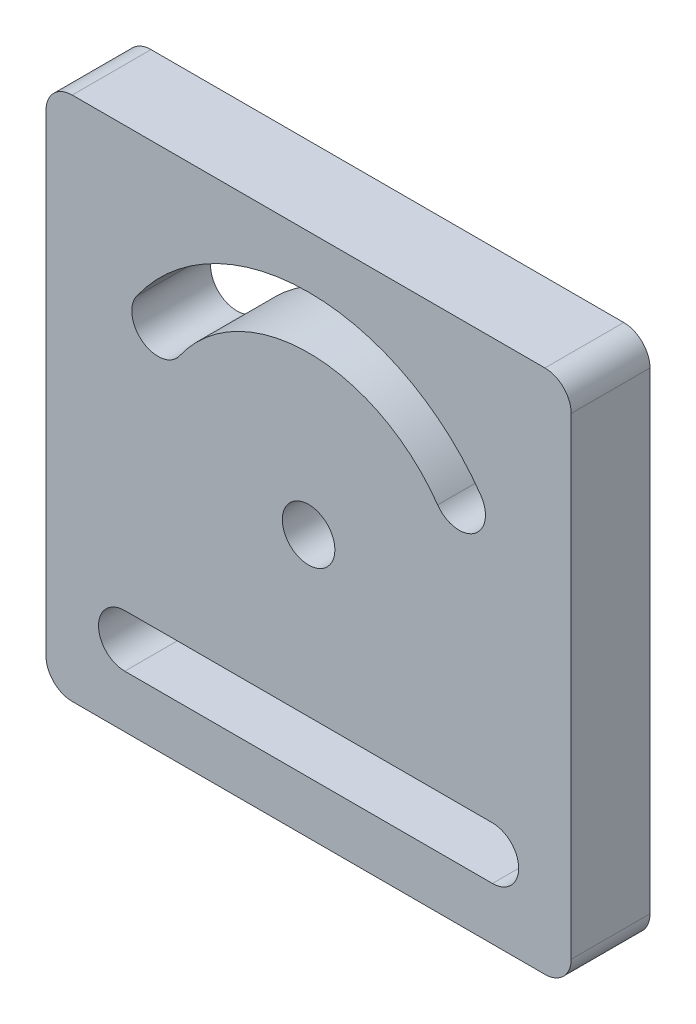
ISO-10303-21;
HEADER;
FILE_DESCRIPTION(('STEP AP214'),'2;1');
FILE_NAME('part.step','',(''),(''),'','','');
FILE_SCHEMA(('AUTOMOTIVE_DESIGN { 1 0 10303 214 1 1 1 1 }'));
ENDSEC;
DATA;
#1=APPLICATION_CONTEXT('core data for automotive mechanical design processes');
#2=APPLICATION_PROTOCOL_DEFINITION('international standard','automotive_design',2000,#1);
#3=PRODUCT_CONTEXT('',#1,'mechanical');
#4=PRODUCT('Part','Part','',(#3));
#5=PRODUCT_RELATED_PRODUCT_CATEGORY('part','',(#4));
#6=PRODUCT_DEFINITION_FORMATION('','',#4);
#7=PRODUCT_DEFINITION_CONTEXT('part definition',#1,'design');
#8=PRODUCT_DEFINITION('design','',#6,#7);
#9=PRODUCT_DEFINITION_SHAPE('','',#8);
#10=(LENGTH_UNIT() NAMED_UNIT(*) SI_UNIT(.MILLI.,.METRE.));
#11=(NAMED_UNIT(*) PLANE_ANGLE_UNIT() SI_UNIT($,.RADIAN.));
#12=(NAMED_UNIT(*) SI_UNIT($,.STERADIAN.) SOLID_ANGLE_UNIT());
#13=UNCERTAINTY_MEASURE_WITH_UNIT(LENGTH_MEASURE(1.E-05),#10,'distance_accuracy_value','');
#14=(GEOMETRIC_REPRESENTATION_CONTEXT(3) GLOBAL_UNCERTAINTY_ASSIGNED_CONTEXT((#13)) GLOBAL_UNIT_ASSIGNED_CONTEXT((#10,
#11,#12)) REPRESENTATION_CONTEXT('',''));
#15=CARTESIAN_POINT('',(0.,0.,0.));
#16=DIRECTION('',(0.,0.,1.));
#17=DIRECTION('',(1.,0.,0.));
#18=AXIS2_PLACEMENT_3D('',#15,#16,#17);
#19=CARTESIAN_POINT('',(0.,0.,30.));
#20=DIRECTION('',(0.,0.,1.));
#21=DIRECTION('',(1.,0.,0.));
#22=AXIS2_PLACEMENT_3D('',#19,#20,#21);
#23=PLANE('',#22);
#24=DIRECTION('',(0.,-1.,0.));
#25=VECTOR('',#24,1.);
#26=CARTESIAN_POINT('',(-100.,-100.,30.));
#27=LINE('',#26,#25);
#28=CARTESIAN_POINT('',(-100.,90.,30.));
#29=VERTEX_POINT('',#28);
#30=CARTESIAN_POINT('',(-100.,-90.0000000000001,30.));
#31=VERTEX_POINT('',#30);
#32=EDGE_CURVE('E226',#29,#31,#27,.T.);
#33=ORIENTED_EDGE('',*,*,#32,.T.);
#34=CARTESIAN_POINT('',(-90.,-90.0000000000001,30.));
#35=DIRECTION('',(0.,0.,1.));
#36=DIRECTION('',(1.,0.,0.));
#37=AXIS2_PLACEMENT_3D('',#34,#35,#36);
#38=CIRCLE('',#37,10.);
#39=CARTESIAN_POINT('',(-90.,-100.,30.));
#40=VERTEX_POINT('',#39);
#41=EDGE_CURVE('E269',#31,#40,#38,.T.);
#42=ORIENTED_EDGE('',*,*,#41,.T.);
#43=DIRECTION('',(1.,0.,0.));
#44=VECTOR('',#43,1.);
#45=CARTESIAN_POINT('',(100.,-100.,30.));
#46=LINE('',#45,#44);
#47=CARTESIAN_POINT('',(90.,-100.,30.));
#48=VERTEX_POINT('',#47);
#49=EDGE_CURVE('E229',#40,#48,#46,.T.);
#50=ORIENTED_EDGE('',*,*,#49,.T.);
#51=CARTESIAN_POINT('',(90.,-90.0000000000001,30.));
#52=DIRECTION('',(0.,0.,1.));
#53=DIRECTION('',(1.,0.,0.));
#54=AXIS2_PLACEMENT_3D('',#51,#52,#53);
#55=CIRCLE('',#54,10.);
#56=CARTESIAN_POINT('',(100.,-90.0000000000001,30.));
#57=VERTEX_POINT('',#56);
#58=EDGE_CURVE('E267',#48,#57,#55,.T.);
#59=ORIENTED_EDGE('',*,*,#58,.T.);
#60=DIRECTION('',(0.,1.,0.));
#61=VECTOR('',#60,1.);
#62=CARTESIAN_POINT('',(100.,-100.,30.));
#63=LINE('',#62,#61);
#64=CARTESIAN_POINT('',(100.,90.,30.));
#65=VERTEX_POINT('',#64);
#66=EDGE_CURVE('E233',#57,#65,#63,.T.);
#67=ORIENTED_EDGE('',*,*,#66,.T.);
#68=CARTESIAN_POINT('',(90.,90.,30.));
#69=DIRECTION('',(0.,0.,1.));
#70=DIRECTION('',(1.,0.,0.));
#71=AXIS2_PLACEMENT_3D('',#68,#69,#70);
#72=CIRCLE('',#71,10.);
#73=CARTESIAN_POINT('',(90.,100.,30.));
#74=VERTEX_POINT('',#73);
#75=EDGE_CURVE('E54',#65,#74,#72,.T.);
#76=ORIENTED_EDGE('',*,*,#75,.T.);
#77=DIRECTION('',(-1.,0.,0.));
#78=VECTOR('',#77,1.);
#79=CARTESIAN_POINT('',(100.,100.,30.));
#80=LINE('',#79,#78);
#81=CARTESIAN_POINT('',(-90.,99.9999999999999,30.));
#82=VERTEX_POINT('',#81);
#83=EDGE_CURVE('E235',#74,#82,#80,.T.);
#84=ORIENTED_EDGE('',*,*,#83,.T.);
#85=CARTESIAN_POINT('',(-90.,90.,30.));
#86=DIRECTION('',(0.,0.,1.));
#87=DIRECTION('',(1.,0.,0.));
#88=AXIS2_PLACEMENT_3D('',#85,#86,#87);
#89=CIRCLE('',#88,10.);
#90=EDGE_CURVE('E264',#82,#29,#89,.T.);
#91=ORIENTED_EDGE('',*,*,#90,.T.);
#92=EDGE_LOOP('',(#33,#42,#50,#59,#67,#76,#84,#91));
#93=FACE_BOUND('',#92,.T.);
#94=CARTESIAN_POINT('',(0.,0.,30.));
#95=DIRECTION('',(0.,0.,1.));
#96=DIRECTION('',(1.,0.,0.));
#97=AXIS2_PLACEMENT_3D('',#94,#95,#96);
#98=CIRCLE('',#97,10.);
#99=CARTESIAN_POINT('',(10.,0.,30.));
#100=VERTEX_POINT('',#99);
#101=EDGE_CURVE('E220',#100,#100,#98,.T.);
#102=ORIENTED_EDGE('',*,*,#101,.F.);
#103=EDGE_LOOP('',(#102));
#104=FACE_BOUND('',#103,.T.);
#105=DIRECTION('',(-1.,0.,0.));
#106=VECTOR('',#105,1.);
#107=CARTESIAN_POINT('',(70.,-60.0000000000001,30.));
#108=LINE('',#107,#106);
#109=CARTESIAN_POINT('',(70.,-60.0000000000001,30.));
#110=VERTEX_POINT('',#109);
#111=CARTESIAN_POINT('',(-70.,-60.0000000000001,30.));
#112=VERTEX_POINT('',#111);
#113=EDGE_CURVE('E191',#110,#112,#108,.T.);
#114=ORIENTED_EDGE('',*,*,#113,.F.);
#115=CARTESIAN_POINT('',(70.,-70.,30.));
#116=DIRECTION('',(0.,0.,1.));
#117=DIRECTION('',(1.,0.,0.));
#118=AXIS2_PLACEMENT_3D('',#115,#116,#117);
#119=CIRCLE('',#118,9.99999999999999);
#120=CARTESIAN_POINT('',(70.,-80.0000000000001,30.));
#121=VERTEX_POINT('',#120);
#122=EDGE_CURVE('E189',#121,#110,#119,.T.);
#123=ORIENTED_EDGE('',*,*,#122,.F.);
#124=DIRECTION('',(1.,0.,0.));
#125=VECTOR('',#124,1.);
#126=CARTESIAN_POINT('',(70.,-80.0000000000001,30.));
#127=LINE('',#126,#125);
#128=CARTESIAN_POINT('',(-70.,-80.0000000000001,30.));
#129=VERTEX_POINT('',#128);
#130=EDGE_CURVE('E197',#129,#121,#127,.T.);
#131=ORIENTED_EDGE('',*,*,#130,.F.);
#132=CARTESIAN_POINT('',(-70.,-70.0000000000001,30.));
#133=DIRECTION('',(0.,0.,1.));
#134=DIRECTION('',(1.,0.,0.));
#135=AXIS2_PLACEMENT_3D('',#132,#133,#134);
#136=CIRCLE('',#135,9.99999999999999);
#137=EDGE_CURVE('E194',#112,#129,#136,.T.);
#138=ORIENTED_EDGE('',*,*,#137,.F.);
#139=EDGE_LOOP('',(#114,#123,#131,#138));
#140=FACE_BOUND('',#139,.T.);
#141=CARTESIAN_POINT('',(0.,0.,30.));
#142=DIRECTION('',(0.,0.,1.));
#143=DIRECTION('',(1.,0.,0.));
#144=AXIS2_PLACEMENT_3D('',#141,#142,#143);
#145=CIRCLE('',#144,80.);
#146=CARTESIAN_POINT('',(65.5321635431193,45.8861149080838,30.));
#147=VERTEX_POINT('',#146);
#148=CARTESIAN_POINT('',(-65.5321635431196,45.8861149080833,30.));
#149=VERTEX_POINT('',#148);
#150=EDGE_CURVE('E158',#147,#149,#145,.T.);
#151=ORIENTED_EDGE('',*,*,#150,.F.);
#152=CARTESIAN_POINT('',(57.3406431002294,40.1503505445733,30.));
#153=DIRECTION('',(0.,0.,1.));
#154=DIRECTION('',(1.,0.,0.));
#155=AXIS2_PLACEMENT_3D('',#152,#153,#154);
#156=CIRCLE('',#155,9.99999999999999);
#157=CARTESIAN_POINT('',(49.1491226573395,34.4145861810628,30.));
#158=VERTEX_POINT('',#157);
#159=EDGE_CURVE('E148',#158,#147,#156,.T.);
#160=ORIENTED_EDGE('',*,*,#159,.F.);
#161=CARTESIAN_POINT('',(0.,0.,30.));
#162=DIRECTION('',(0.,0.,-1.));
#163=DIRECTION('',(1.,0.,0.));
#164=AXIS2_PLACEMENT_3D('',#161,#162,#163);
#165=CIRCLE('',#164,60.);
#166=CARTESIAN_POINT('',(-49.1491226573397,34.4145861810625,30.));
#167=VERTEX_POINT('',#166);
#168=EDGE_CURVE('E173',#167,#158,#165,.T.);
#169=ORIENTED_EDGE('',*,*,#168,.F.);
#170=CARTESIAN_POINT('',(-57.3406431002296,40.1503505445729,30.));
#171=DIRECTION('',(0.,0.,1.));
#172=DIRECTION('',(1.,0.,0.));
#173=AXIS2_PLACEMENT_3D('',#170,#171,#172);
#174=CIRCLE('',#173,10.);
#175=EDGE_CURVE('E171',#149,#167,#174,.T.);
#176=ORIENTED_EDGE('',*,*,#175,.F.);
#177=EDGE_LOOP('',(#151,#160,#169,#176));
#178=FACE_BOUND('',#177,.T.);
#179=ADVANCED_FACE('F33',(#93,#104,#140,#178),#23,.T.);
#180=CARTESIAN_POINT('',(0.,0.,0.));
#181=DIRECTION('',(0.,0.,1.));
#182=DIRECTION('',(1.,0.,0.));
#183=AXIS2_PLACEMENT_3D('',#180,#181,#182);
#184=PLANE('',#183);
#185=CARTESIAN_POINT('',(70.,-70.,0.));
#186=DIRECTION('',(0.,0.,1.));
#187=DIRECTION('',(1.,0.,0.));
#188=AXIS2_PLACEMENT_3D('',#185,#186,#187);
#189=CIRCLE('',#188,9.99999999999999);
#190=CARTESIAN_POINT('',(70.,-80.0000000000001,0.));
#191=VERTEX_POINT('',#190);
#192=CARTESIAN_POINT('',(70.,-60.0000000000001,0.));
#193=VERTEX_POINT('',#192);
#194=EDGE_CURVE('E166',#191,#193,#189,.T.);
#195=ORIENTED_EDGE('',*,*,#194,.T.);
#196=DIRECTION('',(-1.,0.,0.));
#197=VECTOR('',#196,1.);
#198=CARTESIAN_POINT('',(70.,-60.0000000000001,0.));
#199=LINE('',#198,#197);
#200=CARTESIAN_POINT('',(-70.,-60.0000000000001,0.));
#201=VERTEX_POINT('',#200);
#202=EDGE_CURVE('E202',#193,#201,#199,.T.);
#203=ORIENTED_EDGE('',*,*,#202,.T.);
#204=CARTESIAN_POINT('',(-70.,-70.0000000000001,0.));
#205=DIRECTION('',(0.,0.,1.));
#206=DIRECTION('',(1.,0.,0.));
#207=AXIS2_PLACEMENT_3D('',#204,#205,#206);
#208=CIRCLE('',#207,9.99999999999999);
#209=CARTESIAN_POINT('',(-70.,-80.0000000000001,0.));
#210=VERTEX_POINT('',#209);
#211=EDGE_CURVE('E205',#201,#210,#208,.T.);
#212=ORIENTED_EDGE('',*,*,#211,.T.);
#213=DIRECTION('',(1.,0.,0.));
#214=VECTOR('',#213,1.);
#215=CARTESIAN_POINT('',(70.,-80.0000000000001,0.));
#216=LINE('',#215,#214);
#217=EDGE_CURVE('E192',#210,#191,#216,.T.);
#218=ORIENTED_EDGE('',*,*,#217,.T.);
#219=EDGE_LOOP('',(#195,#203,#212,#218));
#220=FACE_BOUND('',#219,.T.);
#221=DIRECTION('',(1.,0.,0.));
#222=VECTOR('',#221,1.);
#223=CARTESIAN_POINT('',(100.,-100.,0.));
#224=LINE('',#223,#222);
#225=CARTESIAN_POINT('',(-90.,-100.,0.));
#226=VERTEX_POINT('',#225);
#227=CARTESIAN_POINT('',(90.,-100.,0.));
#228=VERTEX_POINT('',#227);
#229=EDGE_CURVE('E240',#226,#228,#224,.T.);
#230=ORIENTED_EDGE('',*,*,#229,.F.);
#231=CARTESIAN_POINT('',(-90.,-90.0000000000001,0.));
#232=DIRECTION('',(0.,0.,1.));
#233=DIRECTION('',(1.,0.,0.));
#234=AXIS2_PLACEMENT_3D('',#231,#232,#233);
#235=CIRCLE('',#234,10.);
#236=CARTESIAN_POINT('',(-100.,-90.0000000000001,0.));
#237=VERTEX_POINT('',#236);
#238=EDGE_CURVE('E257',#226,#237,#235,.F.);
#239=ORIENTED_EDGE('',*,*,#238,.T.);
#240=DIRECTION('',(0.,-1.,0.));
#241=VECTOR('',#240,1.);
#242=CARTESIAN_POINT('',(-100.,-100.,0.));
#243=LINE('',#242,#241);
#244=CARTESIAN_POINT('',(-100.,90.,0.));
#245=VERTEX_POINT('',#244);
#246=EDGE_CURVE('E223',#245,#237,#243,.T.);
#247=ORIENTED_EDGE('',*,*,#246,.F.);
#248=CARTESIAN_POINT('',(-90.,90.,0.));
#249=DIRECTION('',(0.,0.,1.));
#250=DIRECTION('',(1.,0.,0.));
#251=AXIS2_PLACEMENT_3D('',#248,#249,#250);
#252=CIRCLE('',#251,10.);
#253=CARTESIAN_POINT('',(-90.,99.9999999999999,0.));
#254=VERTEX_POINT('',#253);
#255=EDGE_CURVE('E251',#245,#254,#252,.F.);
#256=ORIENTED_EDGE('',*,*,#255,.T.);
#257=DIRECTION('',(-1.,0.,0.));
#258=VECTOR('',#257,1.);
#259=CARTESIAN_POINT('',(100.,100.,0.));
#260=LINE('',#259,#258);
#261=CARTESIAN_POINT('',(90.,100.,0.));
#262=VERTEX_POINT('',#261);
#263=EDGE_CURVE('E230',#262,#254,#260,.T.);
#264=ORIENTED_EDGE('',*,*,#263,.F.);
#265=CARTESIAN_POINT('',(90.,90.,0.));
#266=DIRECTION('',(0.,0.,1.));
#267=DIRECTION('',(1.,0.,0.));
#268=AXIS2_PLACEMENT_3D('',#265,#266,#267);
#269=CIRCLE('',#268,10.);
#270=CARTESIAN_POINT('',(100.,90.,0.));
#271=VERTEX_POINT('',#270);
#272=EDGE_CURVE('E253',#262,#271,#269,.F.);
#273=ORIENTED_EDGE('',*,*,#272,.T.);
#274=DIRECTION('',(0.,1.,0.));
#275=VECTOR('',#274,1.);
#276=CARTESIAN_POINT('',(100.,-100.,0.));
#277=LINE('',#276,#275);
#278=CARTESIAN_POINT('',(100.,-90.0000000000001,0.));
#279=VERTEX_POINT('',#278);
#280=EDGE_CURVE('E243',#279,#271,#277,.T.);
#281=ORIENTED_EDGE('',*,*,#280,.F.);
#282=CARTESIAN_POINT('',(90.,-90.0000000000001,0.));
#283=DIRECTION('',(0.,0.,1.));
#284=DIRECTION('',(1.,0.,0.));
#285=AXIS2_PLACEMENT_3D('',#282,#283,#284);
#286=CIRCLE('',#285,10.);
#287=EDGE_CURVE('E255',#279,#228,#286,.F.);
#288=ORIENTED_EDGE('',*,*,#287,.T.);
#289=EDGE_LOOP('',(#230,#239,#247,#256,#264,#273,#281,#288));
#290=FACE_BOUND('',#289,.T.);
#291=CARTESIAN_POINT('',(0.,0.,0.));
#292=DIRECTION('',(0.,0.,1.));
#293=DIRECTION('',(1.,0.,0.));
#294=AXIS2_PLACEMENT_3D('',#291,#292,#293);
#295=CIRCLE('',#294,10.);
#296=CARTESIAN_POINT('',(10.,0.,0.));
#297=VERTEX_POINT('',#296);
#298=EDGE_CURVE('E219',#297,#297,#295,.T.);
#299=ORIENTED_EDGE('',*,*,#298,.T.);
#300=EDGE_LOOP('',(#299));
#301=FACE_BOUND('',#300,.T.);
#302=CARTESIAN_POINT('',(57.3406431002294,40.1503505445733,0.));
#303=DIRECTION('',(0.,0.,1.));
#304=DIRECTION('',(1.,0.,0.));
#305=AXIS2_PLACEMENT_3D('',#302,#303,#304);
#306=CIRCLE('',#305,9.99999999999999);
#307=CARTESIAN_POINT('',(49.1491226573395,34.4145861810628,0.));
#308=VERTEX_POINT('',#307);
#309=CARTESIAN_POINT('',(65.5321635431193,45.8861149080838,0.));
#310=VERTEX_POINT('',#309);
#311=EDGE_CURVE('E177',#308,#310,#306,.T.);
#312=ORIENTED_EDGE('',*,*,#311,.T.);
#313=CARTESIAN_POINT('',(0.,0.,0.));
#314=DIRECTION('',(0.,0.,1.));
#315=DIRECTION('',(1.,0.,0.));
#316=AXIS2_PLACEMENT_3D('',#313,#314,#315);
#317=CIRCLE('',#316,80.);
#318=CARTESIAN_POINT('',(-65.5321635431196,45.8861149080833,0.));
#319=VERTEX_POINT('',#318);
#320=EDGE_CURVE('E165',#310,#319,#317,.T.);
#321=ORIENTED_EDGE('',*,*,#320,.T.);
#322=CARTESIAN_POINT('',(-57.3406431002296,40.1503505445729,0.));
#323=DIRECTION('',(0.,0.,1.));
#324=DIRECTION('',(1.,0.,0.));
#325=AXIS2_PLACEMENT_3D('',#322,#323,#324);
#326=CIRCLE('',#325,10.);
#327=CARTESIAN_POINT('',(-49.1491226573397,34.4145861810625,0.));
#328=VERTEX_POINT('',#327);
#329=EDGE_CURVE('E180',#319,#328,#326,.T.);
#330=ORIENTED_EDGE('',*,*,#329,.T.);
#331=CARTESIAN_POINT('',(0.,0.,0.));
#332=DIRECTION('',(0.,0.,-1.));
#333=DIRECTION('',(1.,0.,0.));
#334=AXIS2_PLACEMENT_3D('',#331,#332,#333);
#335=CIRCLE('',#334,60.);
#336=EDGE_CURVE('E159',#328,#308,#335,.T.);
#337=ORIENTED_EDGE('',*,*,#336,.T.);
#338=EDGE_LOOP('',(#312,#321,#330,#337));
#339=FACE_BOUND('',#338,.T.);
#340=ADVANCED_FACE('F285',(#220,#290,#301,#339),#184,.F.);
#341=CARTESIAN_POINT('',(-100.,-100.,30.));
#342=DIRECTION('',(1.,0.,0.));
#343=DIRECTION('',(0.,0.,-1.));
#344=AXIS2_PLACEMENT_3D('',#341,#342,#343);
#345=PLANE('',#344);
#346=ORIENTED_EDGE('',*,*,#246,.T.);
#347=DIRECTION('',(0.,0.,-1.));
#348=VECTOR('',#347,1.);
#349=CARTESIAN_POINT('',(-100.,-90.0000000000001,30.));
#350=LINE('',#349,#348);
#351=EDGE_CURVE('E262',#237,#31,#350,.F.);
#352=ORIENTED_EDGE('',*,*,#351,.T.);
#353=ORIENTED_EDGE('',*,*,#32,.F.);
#354=DIRECTION('',(0.,0.,-1.));
#355=VECTOR('',#354,1.);
#356=CARTESIAN_POINT('',(-100.,90.,30.));
#357=LINE('',#356,#355);
#358=EDGE_CURVE('E259',#29,#245,#357,.T.);
#359=ORIENTED_EDGE('',*,*,#358,.T.);
#360=EDGE_LOOP('',(#346,#352,#353,#359));
#361=FACE_BOUND('',#360,.T.);
#362=ADVANCED_FACE('F299',(#361),#345,.F.);
#363=CARTESIAN_POINT('',(100.,-100.,30.));
#364=DIRECTION('',(0.,1.,0.));
#365=DIRECTION('',(-1.,0.,0.));
#366=AXIS2_PLACEMENT_3D('',#363,#364,#365);
#367=PLANE('',#366);
#368=ORIENTED_EDGE('',*,*,#49,.F.);
#369=DIRECTION('',(0.,0.,-1.));
#370=VECTOR('',#369,1.);
#371=CARTESIAN_POINT('',(-90.,-100.,30.));
#372=LINE('',#371,#370);
#373=EDGE_CURVE('E248',#40,#226,#372,.T.);
#374=ORIENTED_EDGE('',*,*,#373,.T.);
#375=ORIENTED_EDGE('',*,*,#229,.T.);
#376=DIRECTION('',(0.,0.,-1.));
#377=VECTOR('',#376,1.);
#378=CARTESIAN_POINT('',(90.,-100.,30.));
#379=LINE('',#378,#377);
#380=EDGE_CURVE('E237',#228,#48,#379,.F.);
#381=ORIENTED_EDGE('',*,*,#380,.T.);
#382=EDGE_LOOP('',(#368,#374,#375,#381));
#383=FACE_BOUND('',#382,.T.);
#384=ADVANCED_FACE('F307',(#383),#367,.F.);
#385=CARTESIAN_POINT('',(100.,-100.,30.));
#386=DIRECTION('',(-1.,0.,0.));
#387=DIRECTION('',(0.,-1.,0.));
#388=AXIS2_PLACEMENT_3D('',#385,#386,#387);
#389=PLANE('',#388);
#390=ORIENTED_EDGE('',*,*,#66,.F.);
#391=DIRECTION('',(0.,0.,-1.));
#392=VECTOR('',#391,1.);
#393=CARTESIAN_POINT('',(100.,-90.0000000000001,30.));
#394=LINE('',#393,#392);
#395=EDGE_CURVE('E273',#57,#279,#394,.T.);
#396=ORIENTED_EDGE('',*,*,#395,.T.);
#397=ORIENTED_EDGE('',*,*,#280,.T.);
#398=DIRECTION('',(0.,0.,-1.));
#399=VECTOR('',#398,1.);
#400=CARTESIAN_POINT('',(100.,90.,30.));
#401=LINE('',#400,#399);
#402=EDGE_CURVE('E271',#271,#65,#401,.F.);
#403=ORIENTED_EDGE('',*,*,#402,.T.);
#404=EDGE_LOOP('',(#390,#396,#397,#403));
#405=FACE_BOUND('',#404,.T.);
#406=ADVANCED_FACE('F279',(#405),#389,.F.);
#407=CARTESIAN_POINT('',(100.,100.,30.));
#408=DIRECTION('',(0.,-1.,0.));
#409=DIRECTION('',(1.,0.,0.));
#410=AXIS2_PLACEMENT_3D('',#407,#408,#409);
#411=PLANE('',#410);
#412=ORIENTED_EDGE('',*,*,#83,.F.);
#413=DIRECTION('',(0.,0.,-1.));
#414=VECTOR('',#413,1.);
#415=CARTESIAN_POINT('',(90.,100.,30.));
#416=LINE('',#415,#414);
#417=EDGE_CURVE('E11',#74,#262,#416,.T.);
#418=ORIENTED_EDGE('',*,*,#417,.T.);
#419=ORIENTED_EDGE('',*,*,#263,.T.);
#420=DIRECTION('',(0.,0.,-1.));
#421=VECTOR('',#420,1.);
#422=CARTESIAN_POINT('',(-90.,99.9999999999999,30.));
#423=LINE('',#422,#421);
#424=EDGE_CURVE('E41',#254,#82,#423,.F.);
#425=ORIENTED_EDGE('',*,*,#424,.T.);
#426=EDGE_LOOP('',(#412,#418,#419,#425));
#427=FACE_BOUND('',#426,.T.);
#428=ADVANCED_FACE('F291',(#427),#411,.F.);
#429=CARTESIAN_POINT('',(0.,0.,30.));
#430=DIRECTION('',(0.,0.,-1.));
#431=DIRECTION('',(-1.,0.,0.));
#432=AXIS2_PLACEMENT_3D('',#429,#430,#431);
#433=CYLINDRICAL_SURFACE('',#432,10.);
#434=ORIENTED_EDGE('',*,*,#101,.T.);
#435=EDGE_LOOP('',(#434));
#436=FACE_BOUND('',#435,.T.);
#437=ORIENTED_EDGE('',*,*,#298,.F.);
#438=EDGE_LOOP('',(#437));
#439=FACE_BOUND('',#438,.T.);
#440=ADVANCED_FACE('F326',(#436,#439),#433,.F.);
#441=CARTESIAN_POINT('',(70.,-70.,30.));
#442=DIRECTION('',(0.,0.,-1.));
#443=DIRECTION('',(-1.,0.,0.));
#444=AXIS2_PLACEMENT_3D('',#441,#442,#443);
#445=CYLINDRICAL_SURFACE('',#444,9.99999999999999);
#446=ORIENTED_EDGE('',*,*,#194,.F.);
#447=DIRECTION('',(0.,0.,-1.));
#448=VECTOR('',#447,1.);
#449=CARTESIAN_POINT('',(70.,-80.0000000000001,30.));
#450=LINE('',#449,#448);
#451=EDGE_CURVE('E199',#121,#191,#450,.T.);
#452=ORIENTED_EDGE('',*,*,#451,.F.);
#453=ORIENTED_EDGE('',*,*,#122,.T.);
#454=DIRECTION('',(0.,0.,-1.));
#455=VECTOR('',#454,1.);
#456=CARTESIAN_POINT('',(70.,-60.0000000000001,30.));
#457=LINE('',#456,#455);
#458=EDGE_CURVE('E216',#110,#193,#457,.T.);
#459=ORIENTED_EDGE('',*,*,#458,.T.);
#460=EDGE_LOOP('',(#446,#452,#453,#459));
#461=FACE_BOUND('',#460,.T.);
#462=ADVANCED_FACE('F359',(#461),#445,.F.);
#463=CARTESIAN_POINT('',(70.,-60.0000000000001,30.));
#464=DIRECTION('',(0.,-1.,0.));
#465=DIRECTION('',(0.,0.,-1.));
#466=AXIS2_PLACEMENT_3D('',#463,#464,#465);
#467=PLANE('',#466);
#468=ORIENTED_EDGE('',*,*,#202,.F.);
#469=ORIENTED_EDGE('',*,*,#458,.F.);
#470=ORIENTED_EDGE('',*,*,#113,.T.);
#471=DIRECTION('',(0.,0.,-1.));
#472=VECTOR('',#471,1.);
#473=CARTESIAN_POINT('',(-70.,-60.0000000000001,30.));
#474=LINE('',#473,#472);
#475=EDGE_CURVE('E214',#112,#201,#474,.T.);
#476=ORIENTED_EDGE('',*,*,#475,.T.);
#477=EDGE_LOOP('',(#468,#469,#470,#476));
#478=FACE_BOUND('',#477,.T.);
#479=ADVANCED_FACE('F366',(#478),#467,.T.);
#480=CARTESIAN_POINT('',(-70.,-70.0000000000001,30.));
#481=DIRECTION('',(0.,0.,-1.));
#482=DIRECTION('',(-1.,0.,0.));
#483=AXIS2_PLACEMENT_3D('',#480,#481,#482);
#484=CYLINDRICAL_SURFACE('',#483,9.99999999999999);
#485=ORIENTED_EDGE('',*,*,#211,.F.);
#486=ORIENTED_EDGE('',*,*,#475,.F.);
#487=ORIENTED_EDGE('',*,*,#137,.T.);
#488=DIRECTION('',(0.,0.,-1.));
#489=VECTOR('',#488,1.);
#490=CARTESIAN_POINT('',(-70.,-80.0000000000001,30.));
#491=LINE('',#490,#489);
#492=EDGE_CURVE('E212',#129,#210,#491,.T.);
#493=ORIENTED_EDGE('',*,*,#492,.T.);
#494=EDGE_LOOP('',(#485,#486,#487,#493));
#495=FACE_BOUND('',#494,.T.);
#496=ADVANCED_FACE('F373',(#495),#484,.F.);
#497=CARTESIAN_POINT('',(70.,-80.0000000000001,30.));
#498=DIRECTION('',(0.,1.,0.));
#499=DIRECTION('',(0.,0.,1.));
#500=AXIS2_PLACEMENT_3D('',#497,#498,#499);
#501=PLANE('',#500);
#502=ORIENTED_EDGE('',*,*,#217,.F.);
#503=ORIENTED_EDGE('',*,*,#492,.F.);
#504=ORIENTED_EDGE('',*,*,#130,.T.);
#505=ORIENTED_EDGE('',*,*,#451,.T.);
#506=EDGE_LOOP('',(#502,#503,#504,#505));
#507=FACE_BOUND('',#506,.T.);
#508=ADVANCED_FACE('F381',(#507),#501,.T.);
#509=CARTESIAN_POINT('',(57.3406431002294,40.1503505445733,30.));
#510=DIRECTION('',(0.,0.,-1.));
#511=DIRECTION('',(-1.,0.,0.));
#512=AXIS2_PLACEMENT_3D('',#509,#510,#511);
#513=CYLINDRICAL_SURFACE('',#512,9.99999999999999);
#514=ORIENTED_EDGE('',*,*,#311,.F.);
#515=DIRECTION('',(0.,0.,-1.));
#516=VECTOR('',#515,1.);
#517=CARTESIAN_POINT('',(49.1491226573395,34.4145861810628,30.));
#518=LINE('',#517,#516);
#519=EDGE_CURVE('E154',#158,#308,#518,.T.);
#520=ORIENTED_EDGE('',*,*,#519,.F.);
#521=ORIENTED_EDGE('',*,*,#159,.T.);
#522=DIRECTION('',(0.,0.,-1.));
#523=VECTOR('',#522,1.);
#524=CARTESIAN_POINT('',(65.5321635431193,45.8861149080838,30.));
#525=LINE('',#524,#523);
#526=EDGE_CURVE('E151',#147,#310,#525,.T.);
#527=ORIENTED_EDGE('',*,*,#526,.T.);
#528=EDGE_LOOP('',(#514,#520,#521,#527));
#529=FACE_BOUND('',#528,.T.);
#530=ADVANCED_FACE('F150',(#529),#513,.F.);
#531=CARTESIAN_POINT('',(0.,0.,30.));
#532=DIRECTION('',(0.,0.,-1.));
#533=DIRECTION('',(-1.,0.,0.));
#534=AXIS2_PLACEMENT_3D('',#531,#532,#533);
#535=CYLINDRICAL_SURFACE('',#534,80.);
#536=ORIENTED_EDGE('',*,*,#320,.F.);
#537=ORIENTED_EDGE('',*,*,#526,.F.);
#538=ORIENTED_EDGE('',*,*,#150,.T.);
#539=DIRECTION('',(0.,0.,-1.));
#540=VECTOR('',#539,1.);
#541=CARTESIAN_POINT('',(-65.5321635431196,45.8861149080833,30.));
#542=LINE('',#541,#540);
#543=EDGE_CURVE('E167',#149,#319,#542,.T.);
#544=ORIENTED_EDGE('',*,*,#543,.T.);
#545=EDGE_LOOP('',(#536,#537,#538,#544));
#546=FACE_BOUND('',#545,.T.);
#547=ADVANCED_FACE('F162',(#546),#535,.F.);
#548=CARTESIAN_POINT('',(-57.3406431002296,40.1503505445729,30.));
#549=DIRECTION('',(0.,0.,-1.));
#550=DIRECTION('',(-1.,0.,0.));
#551=AXIS2_PLACEMENT_3D('',#548,#549,#550);
#552=CYLINDRICAL_SURFACE('',#551,10.);
#553=ORIENTED_EDGE('',*,*,#329,.F.);
#554=ORIENTED_EDGE('',*,*,#543,.F.);
#555=ORIENTED_EDGE('',*,*,#175,.T.);
#556=DIRECTION('',(0.,0.,-1.));
#557=VECTOR('',#556,1.);
#558=CARTESIAN_POINT('',(-49.1491226573397,34.4145861810625,30.));
#559=LINE('',#558,#557);
#560=EDGE_CURVE('E186',#167,#328,#559,.T.);
#561=ORIENTED_EDGE('',*,*,#560,.T.);
#562=EDGE_LOOP('',(#553,#554,#555,#561));
#563=FACE_BOUND('',#562,.T.);
#564=ADVANCED_FACE('F402',(#563),#552,.F.);
#565=CARTESIAN_POINT('',(0.,0.,30.));
#566=DIRECTION('',(0.,0.,-1.));
#567=DIRECTION('',(-1.,0.,0.));
#568=AXIS2_PLACEMENT_3D('',#565,#566,#567);
#569=CYLINDRICAL_SURFACE('',#568,60.);
#570=ORIENTED_EDGE('',*,*,#336,.F.);
#571=ORIENTED_EDGE('',*,*,#560,.F.);
#572=ORIENTED_EDGE('',*,*,#168,.T.);
#573=ORIENTED_EDGE('',*,*,#519,.T.);
#574=EDGE_LOOP('',(#570,#571,#572,#573));
#575=FACE_BOUND('',#574,.T.);
#576=ADVANCED_FACE('F316',(#575),#569,.T.);
#577=CARTESIAN_POINT('',(-90.,-90.0000000000001,30.));
#578=DIRECTION('',(0.,0.,-1.));
#579=DIRECTION('',(-1.,0.,0.));
#580=AXIS2_PLACEMENT_3D('',#577,#578,#579);
#581=CYLINDRICAL_SURFACE('',#580,10.);
#582=ORIENTED_EDGE('',*,*,#41,.F.);
#583=ORIENTED_EDGE('',*,*,#351,.F.);
#584=ORIENTED_EDGE('',*,*,#238,.F.);
#585=ORIENTED_EDGE('',*,*,#373,.F.);
#586=EDGE_LOOP('',(#582,#583,#584,#585));
#587=FACE_BOUND('',#586,.T.);
#588=ADVANCED_FACE('F304',(#587),#581,.T.);
#589=CARTESIAN_POINT('',(90.,-90.0000000000001,30.));
#590=DIRECTION('',(0.,0.,-1.));
#591=DIRECTION('',(-1.,0.,0.));
#592=AXIS2_PLACEMENT_3D('',#589,#590,#591);
#593=CYLINDRICAL_SURFACE('',#592,10.);
#594=ORIENTED_EDGE('',*,*,#58,.F.);
#595=ORIENTED_EDGE('',*,*,#380,.F.);
#596=ORIENTED_EDGE('',*,*,#287,.F.);
#597=ORIENTED_EDGE('',*,*,#395,.F.);
#598=EDGE_LOOP('',(#594,#595,#596,#597));
#599=FACE_BOUND('',#598,.T.);
#600=ADVANCED_FACE('F309',(#599),#593,.T.);
#601=CARTESIAN_POINT('',(90.,90.,30.));
#602=DIRECTION('',(0.,0.,-1.));
#603=DIRECTION('',(-1.,0.,0.));
#604=AXIS2_PLACEMENT_3D('',#601,#602,#603);
#605=CYLINDRICAL_SURFACE('',#604,10.);
#606=ORIENTED_EDGE('',*,*,#75,.F.);
#607=ORIENTED_EDGE('',*,*,#402,.F.);
#608=ORIENTED_EDGE('',*,*,#272,.F.);
#609=ORIENTED_EDGE('',*,*,#417,.F.);
#610=EDGE_LOOP('',(#606,#607,#608,#609));
#611=FACE_BOUND('',#610,.T.);
#612=ADVANCED_FACE('F290',(#611),#605,.T.);
#613=CARTESIAN_POINT('',(-90.,90.,30.));
#614=DIRECTION('',(0.,0.,-1.));
#615=DIRECTION('',(-1.,0.,0.));
#616=AXIS2_PLACEMENT_3D('',#613,#614,#615);
#617=CYLINDRICAL_SURFACE('',#616,10.);
#618=ORIENTED_EDGE('',*,*,#90,.F.);
#619=ORIENTED_EDGE('',*,*,#424,.F.);
#620=ORIENTED_EDGE('',*,*,#255,.F.);
#621=ORIENTED_EDGE('',*,*,#358,.F.);
#622=EDGE_LOOP('',(#618,#619,#620,#621));
#623=FACE_BOUND('',#622,.T.);
#624=ADVANCED_FACE('F35',(#623),#617,.T.);
#625=CLOSED_SHELL('',(#179,#340,#362,#384,#406,#428,#440,#462,#479,#496,#508,#530,#547,#564,
#576,#588,#600,#612,#624));
#626=MANIFOLD_SOLID_BREP('B2',#625);
#627=ADVANCED_BREP_SHAPE_REPRESENTATION('',(#18,#626),#14);
#628=SHAPE_DEFINITION_REPRESENTATION(#9,#627);
ENDSEC;
END-ISO-10303-21;
